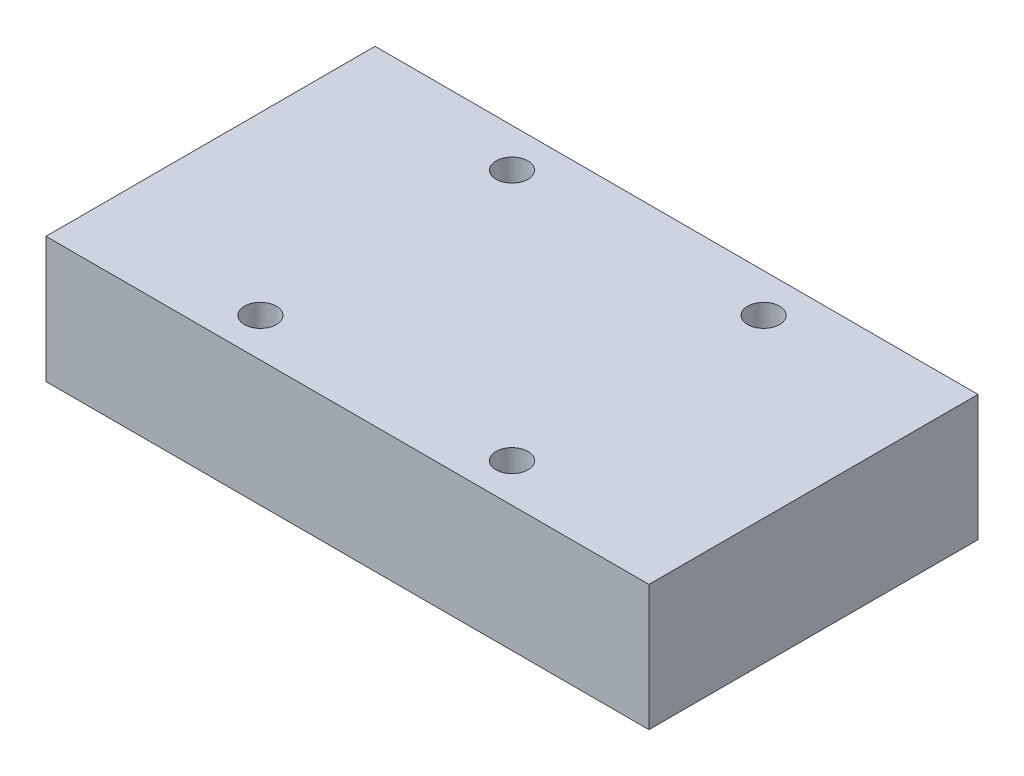
ISO-10303-21;
HEADER;
FILE_DESCRIPTION(('STEP AP214'),'2;1');
FILE_NAME('part.step','',(''),(''),'','','');
FILE_SCHEMA(('AUTOMOTIVE_DESIGN { 1 0 10303 214 1 1 1 1 }'));
ENDSEC;
DATA;
#1=APPLICATION_CONTEXT('core data for automotive mechanical design processes');
#2=APPLICATION_PROTOCOL_DEFINITION('international standard','automotive_design',2000,#1);
#3=PRODUCT_CONTEXT('',#1,'mechanical');
#4=PRODUCT('Part','Part','',(#3));
#5=PRODUCT_RELATED_PRODUCT_CATEGORY('part','',(#4));
#6=PRODUCT_DEFINITION_FORMATION('','',#4);
#7=PRODUCT_DEFINITION_CONTEXT('part definition',#1,'design');
#8=PRODUCT_DEFINITION('design','',#6,#7);
#9=PRODUCT_DEFINITION_SHAPE('','',#8);
#10=(LENGTH_UNIT() NAMED_UNIT(*) SI_UNIT(.MILLI.,.METRE.));
#11=(NAMED_UNIT(*) PLANE_ANGLE_UNIT() SI_UNIT($,.RADIAN.));
#12=(NAMED_UNIT(*) SI_UNIT($,.STERADIAN.) SOLID_ANGLE_UNIT());
#13=UNCERTAINTY_MEASURE_WITH_UNIT(LENGTH_MEASURE(1.E-05),#10,'distance_accuracy_value','');
#14=(GEOMETRIC_REPRESENTATION_CONTEXT(3) GLOBAL_UNCERTAINTY_ASSIGNED_CONTEXT((#13)) GLOBAL_UNIT_ASSIGNED_CONTEXT((#10,
#11,#12)) REPRESENTATION_CONTEXT('',''));
#15=CARTESIAN_POINT('',(0.,0.,0.));
#16=DIRECTION('',(0.,0.,1.));
#17=DIRECTION('',(1.,0.,0.));
#18=AXIS2_PLACEMENT_3D('',#15,#16,#17);
#19=CARTESIAN_POINT('',(31.15,13.,-17.));
#20=DIRECTION('',(-1.,0.,0.));
#21=DIRECTION('',(0.,0.,1.));
#22=AXIS2_PLACEMENT_3D('',#19,#20,#21);
#23=PLANE('',#22);
#24=DIRECTION('',(0.,0.,-1.));
#25=VECTOR('',#24,1.);
#26=CARTESIAN_POINT('',(31.15,0.,-17.));
#27=LINE('',#26,#25);
#28=CARTESIAN_POINT('',(31.15,0.,17.));
#29=VERTEX_POINT('',#28);
#30=CARTESIAN_POINT('',(31.15,0.,-17.));
#31=VERTEX_POINT('',#30);
#32=EDGE_CURVE('E130',#29,#31,#27,.T.);
#33=ORIENTED_EDGE('',*,*,#32,.T.);
#34=DIRECTION('',(0.,-1.,0.));
#35=VECTOR('',#34,1.);
#36=CARTESIAN_POINT('',(31.15,13.,-17.));
#37=LINE('',#36,#35);
#38=CARTESIAN_POINT('',(31.15,13.,-17.));
#39=VERTEX_POINT('',#38);
#40=EDGE_CURVE('E11',#39,#31,#37,.T.);
#41=ORIENTED_EDGE('',*,*,#40,.F.);
#42=DIRECTION('',(0.,0.,-1.));
#43=VECTOR('',#42,1.);
#44=CARTESIAN_POINT('',(31.15,13.,-17.));
#45=LINE('',#44,#43);
#46=CARTESIAN_POINT('',(31.15,13.,17.));
#47=VERTEX_POINT('',#46);
#48=EDGE_CURVE('E131',#47,#39,#45,.T.);
#49=ORIENTED_EDGE('',*,*,#48,.F.);
#50=DIRECTION('',(0.,-1.,0.));
#51=VECTOR('',#50,1.);
#52=CARTESIAN_POINT('',(31.15,13.,17.));
#53=LINE('',#52,#51);
#54=EDGE_CURVE('E137',#47,#29,#53,.T.);
#55=ORIENTED_EDGE('',*,*,#54,.T.);
#56=EDGE_LOOP('',(#33,#41,#49,#55));
#57=FACE_BOUND('',#56,.T.);
#58=ADVANCED_FACE('F37',(#57),#23,.F.);
#59=CARTESIAN_POINT('',(-31.15,13.,-17.));
#60=DIRECTION('',(0.,0.,1.));
#61=DIRECTION('',(1.,0.,0.));
#62=AXIS2_PLACEMENT_3D('',#59,#60,#61);
#63=PLANE('',#62);
#64=DIRECTION('',(-1.,0.,0.));
#65=VECTOR('',#64,1.);
#66=CARTESIAN_POINT('',(-31.15,0.,-17.));
#67=LINE('',#66,#65);
#68=CARTESIAN_POINT('',(-31.15,0.,-17.));
#69=VERTEX_POINT('',#68);
#70=EDGE_CURVE('E140',#31,#69,#67,.T.);
#71=ORIENTED_EDGE('',*,*,#70,.T.);
#72=DIRECTION('',(0.,-1.,0.));
#73=VECTOR('',#72,1.);
#74=CARTESIAN_POINT('',(-31.15,13.,-17.));
#75=LINE('',#74,#73);
#76=CARTESIAN_POINT('',(-31.15,13.,-17.));
#77=VERTEX_POINT('',#76);
#78=EDGE_CURVE('E45',#77,#69,#75,.T.);
#79=ORIENTED_EDGE('',*,*,#78,.F.);
#80=DIRECTION('',(-1.,0.,0.));
#81=VECTOR('',#80,1.);
#82=CARTESIAN_POINT('',(-31.15,13.,-17.));
#83=LINE('',#82,#81);
#84=EDGE_CURVE('E84',#39,#77,#83,.T.);
#85=ORIENTED_EDGE('',*,*,#84,.F.);
#86=ORIENTED_EDGE('',*,*,#40,.T.);
#87=EDGE_LOOP('',(#71,#79,#85,#86));
#88=FACE_BOUND('',#87,.T.);
#89=ADVANCED_FACE('F164',(#88),#63,.F.);
#90=CARTESIAN_POINT('',(-31.15,13.,-17.));
#91=DIRECTION('',(1.,0.,0.));
#92=DIRECTION('',(0.,0.,-1.));
#93=AXIS2_PLACEMENT_3D('',#90,#91,#92);
#94=PLANE('',#93);
#95=DIRECTION('',(0.,0.,1.));
#96=VECTOR('',#95,1.);
#97=CARTESIAN_POINT('',(-31.15,0.,-17.));
#98=LINE('',#97,#96);
#99=CARTESIAN_POINT('',(-31.15,0.,17.));
#100=VERTEX_POINT('',#99);
#101=EDGE_CURVE('E71',#69,#100,#98,.T.);
#102=ORIENTED_EDGE('',*,*,#101,.T.);
#103=DIRECTION('',(0.,-1.,0.));
#104=VECTOR('',#103,1.);
#105=CARTESIAN_POINT('',(-31.15,13.,17.));
#106=LINE('',#105,#104);
#107=CARTESIAN_POINT('',(-31.15,13.,17.));
#108=VERTEX_POINT('',#107);
#109=EDGE_CURVE('E145',#108,#100,#106,.T.);
#110=ORIENTED_EDGE('',*,*,#109,.F.);
#111=DIRECTION('',(0.,0.,1.));
#112=VECTOR('',#111,1.);
#113=CARTESIAN_POINT('',(-31.15,13.,-17.));
#114=LINE('',#113,#112);
#115=EDGE_CURVE('E134',#77,#108,#114,.T.);
#116=ORIENTED_EDGE('',*,*,#115,.F.);
#117=ORIENTED_EDGE('',*,*,#78,.T.);
#118=EDGE_LOOP('',(#102,#110,#116,#117));
#119=FACE_BOUND('',#118,.T.);
#120=ADVANCED_FACE('F147',(#119),#94,.F.);
#121=CARTESIAN_POINT('',(-31.15,13.,17.));
#122=DIRECTION('',(0.,0.,-1.));
#123=DIRECTION('',(-1.,0.,0.));
#124=AXIS2_PLACEMENT_3D('',#121,#122,#123);
#125=PLANE('',#124);
#126=DIRECTION('',(1.,0.,0.));
#127=VECTOR('',#126,1.);
#128=CARTESIAN_POINT('',(-31.15,0.,17.));
#129=LINE('',#128,#127);
#130=EDGE_CURVE('E77',#100,#29,#129,.T.);
#131=ORIENTED_EDGE('',*,*,#130,.T.);
#132=ORIENTED_EDGE('',*,*,#54,.F.);
#133=DIRECTION('',(1.,0.,0.));
#134=VECTOR('',#133,1.);
#135=CARTESIAN_POINT('',(-31.15,13.,17.));
#136=LINE('',#135,#134);
#137=EDGE_CURVE('E53',#108,#47,#136,.T.);
#138=ORIENTED_EDGE('',*,*,#137,.F.);
#139=ORIENTED_EDGE('',*,*,#109,.T.);
#140=EDGE_LOOP('',(#131,#132,#138,#139));
#141=FACE_BOUND('',#140,.T.);
#142=ADVANCED_FACE('F154',(#141),#125,.F.);
#143=CARTESIAN_POINT('',(0.,13.,0.));
#144=DIRECTION('',(0.,1.,0.));
#145=DIRECTION('',(0.,0.,1.));
#146=AXIS2_PLACEMENT_3D('',#143,#144,#145);
#147=PLANE('',#146);
#148=CARTESIAN_POINT('',(-13.,13.,-13.));
#149=DIRECTION('',(0.,1.,0.));
#150=DIRECTION('',(0.,0.,1.));
#151=AXIS2_PLACEMENT_3D('',#148,#149,#150);
#152=CIRCLE('',#151,1.65);
#153=CARTESIAN_POINT('',(-13.,13.,-11.35));
#154=VERTEX_POINT('',#153);
#155=EDGE_CURVE('E108',#154,#154,#152,.T.);
#156=ORIENTED_EDGE('',*,*,#155,.F.);
#157=EDGE_LOOP('',(#156));
#158=FACE_BOUND('',#157,.T.);
#159=CARTESIAN_POINT('',(-13.,13.,13.));
#160=DIRECTION('',(0.,1.,0.));
#161=DIRECTION('',(0.,0.,1.));
#162=AXIS2_PLACEMENT_3D('',#159,#160,#161);
#163=CIRCLE('',#162,1.65);
#164=CARTESIAN_POINT('',(-13.,13.,14.65));
#165=VERTEX_POINT('',#164);
#166=EDGE_CURVE('E107',#165,#165,#163,.T.);
#167=ORIENTED_EDGE('',*,*,#166,.F.);
#168=EDGE_LOOP('',(#167));
#169=FACE_BOUND('',#168,.T.);
#170=CARTESIAN_POINT('',(13.,13.,-13.));
#171=DIRECTION('',(0.,1.,0.));
#172=DIRECTION('',(0.,0.,1.));
#173=AXIS2_PLACEMENT_3D('',#170,#171,#172);
#174=CIRCLE('',#173,1.65);
#175=CARTESIAN_POINT('',(13.,13.,-11.35));
#176=VERTEX_POINT('',#175);
#177=EDGE_CURVE('E118',#176,#176,#174,.T.);
#178=ORIENTED_EDGE('',*,*,#177,.F.);
#179=EDGE_LOOP('',(#178));
#180=FACE_BOUND('',#179,.T.);
#181=CARTESIAN_POINT('',(13.,13.,13.));
#182=DIRECTION('',(0.,1.,0.));
#183=DIRECTION('',(0.,0.,1.));
#184=AXIS2_PLACEMENT_3D('',#181,#182,#183);
#185=CIRCLE('',#184,1.65);
#186=CARTESIAN_POINT('',(13.,13.,14.65));
#187=VERTEX_POINT('',#186);
#188=EDGE_CURVE('E124',#187,#187,#185,.T.);
#189=ORIENTED_EDGE('',*,*,#188,.F.);
#190=EDGE_LOOP('',(#189));
#191=FACE_BOUND('',#190,.T.);
#192=ORIENTED_EDGE('',*,*,#48,.T.);
#193=ORIENTED_EDGE('',*,*,#84,.T.);
#194=ORIENTED_EDGE('',*,*,#115,.T.);
#195=ORIENTED_EDGE('',*,*,#137,.T.);
#196=EDGE_LOOP('',(#192,#193,#194,#195));
#197=FACE_BOUND('',#196,.T.);
#198=ADVANCED_FACE('F156',(#158,#169,#180,#191,#197),#147,.T.);
#199=CARTESIAN_POINT('',(0.,0.,0.));
#200=DIRECTION('',(0.,1.,0.));
#201=DIRECTION('',(0.,0.,1.));
#202=AXIS2_PLACEMENT_3D('',#199,#200,#201);
#203=PLANE('',#202);
#204=ORIENTED_EDGE('',*,*,#32,.F.);
#205=ORIENTED_EDGE('',*,*,#130,.F.);
#206=ORIENTED_EDGE('',*,*,#101,.F.);
#207=ORIENTED_EDGE('',*,*,#70,.F.);
#208=EDGE_LOOP('',(#204,#205,#206,#207));
#209=FACE_BOUND('',#208,.T.);
#210=ADVANCED_FACE('F150',(#209),#203,.F.);
#211=CARTESIAN_POINT('',(13.,8.,13.));
#212=DIRECTION('',(0.,1.,0.));
#213=DIRECTION('',(0.,0.,1.));
#214=AXIS2_PLACEMENT_3D('',#211,#212,#213);
#215=CONICAL_SURFACE('',#214,1.65,1.02974425867665);
#216=CARTESIAN_POINT('',(13.,7.00857997860452,13.));
#217=VERTEX_POINT('',#216);
#218=VERTEX_LOOP('',#217);
#219=FACE_BOUND('',#218,.T.);
#220=CARTESIAN_POINT('',(13.,8.,13.));
#221=DIRECTION('',(0.,1.,0.));
#222=DIRECTION('',(0.,0.,1.));
#223=AXIS2_PLACEMENT_3D('',#220,#221,#222);
#224=CIRCLE('',#223,1.65);
#225=CARTESIAN_POINT('',(13.,8.,14.65));
#226=VERTEX_POINT('',#225);
#227=EDGE_CURVE('E127',#226,#226,#224,.T.);
#228=ORIENTED_EDGE('',*,*,#227,.T.);
#229=EDGE_LOOP('',(#228));
#230=FACE_BOUND('',#229,.T.);
#231=ADVANCED_FACE('F191',(#219,#230),#215,.F.);
#232=CARTESIAN_POINT('',(13.,13.,13.));
#233=DIRECTION('',(0.,1.,0.));
#234=DIRECTION('',(0.,0.,1.));
#235=AXIS2_PLACEMENT_3D('',#232,#233,#234);
#236=CYLINDRICAL_SURFACE('',#235,1.65);
#237=ORIENTED_EDGE('',*,*,#227,.F.);
#238=EDGE_LOOP('',(#237));
#239=FACE_BOUND('',#238,.T.);
#240=ORIENTED_EDGE('',*,*,#188,.T.);
#241=EDGE_LOOP('',(#240));
#242=FACE_BOUND('',#241,.T.);
#243=ADVANCED_FACE('F204',(#239,#242),#236,.F.);
#244=CARTESIAN_POINT('',(13.,8.,-13.));
#245=DIRECTION('',(0.,1.,0.));
#246=DIRECTION('',(0.,0.,1.));
#247=AXIS2_PLACEMENT_3D('',#244,#245,#246);
#248=CONICAL_SURFACE('',#247,1.65,1.02974425867665);
#249=CARTESIAN_POINT('',(13.,7.00857997860452,-13.));
#250=VERTEX_POINT('',#249);
#251=VERTEX_LOOP('',#250);
#252=FACE_BOUND('',#251,.T.);
#253=CARTESIAN_POINT('',(13.,8.,-13.));
#254=DIRECTION('',(0.,1.,0.));
#255=DIRECTION('',(0.,0.,1.));
#256=AXIS2_PLACEMENT_3D('',#253,#254,#255);
#257=CIRCLE('',#256,1.65);
#258=CARTESIAN_POINT('',(13.,8.,-11.35));
#259=VERTEX_POINT('',#258);
#260=EDGE_CURVE('E121',#259,#259,#257,.T.);
#261=ORIENTED_EDGE('',*,*,#260,.T.);
#262=EDGE_LOOP('',(#261));
#263=FACE_BOUND('',#262,.T.);
#264=ADVANCED_FACE('F215',(#252,#263),#248,.F.);
#265=CARTESIAN_POINT('',(13.,13.,-13.));
#266=DIRECTION('',(0.,1.,0.));
#267=DIRECTION('',(0.,0.,1.));
#268=AXIS2_PLACEMENT_3D('',#265,#266,#267);
#269=CYLINDRICAL_SURFACE('',#268,1.65);
#270=ORIENTED_EDGE('',*,*,#260,.F.);
#271=EDGE_LOOP('',(#270));
#272=FACE_BOUND('',#271,.T.);
#273=ORIENTED_EDGE('',*,*,#177,.T.);
#274=EDGE_LOOP('',(#273));
#275=FACE_BOUND('',#274,.T.);
#276=ADVANCED_FACE('F226',(#272,#275),#269,.F.);
#277=CARTESIAN_POINT('',(-13.,8.,13.));
#278=DIRECTION('',(0.,1.,0.));
#279=DIRECTION('',(0.,0.,1.));
#280=AXIS2_PLACEMENT_3D('',#277,#278,#279);
#281=CONICAL_SURFACE('',#280,1.65,1.02974425867665);
#282=CARTESIAN_POINT('',(-13.,7.00857997860452,13.));
#283=VERTEX_POINT('',#282);
#284=VERTEX_LOOP('',#283);
#285=FACE_BOUND('',#284,.T.);
#286=CARTESIAN_POINT('',(-13.,8.,13.));
#287=DIRECTION('',(0.,1.,0.));
#288=DIRECTION('',(0.,0.,1.));
#289=AXIS2_PLACEMENT_3D('',#286,#287,#288);
#290=CIRCLE('',#289,1.65);
#291=CARTESIAN_POINT('',(-13.,8.,14.65));
#292=VERTEX_POINT('',#291);
#293=EDGE_CURVE('E111',#292,#292,#290,.T.);
#294=ORIENTED_EDGE('',*,*,#293,.T.);
#295=EDGE_LOOP('',(#294));
#296=FACE_BOUND('',#295,.T.);
#297=ADVANCED_FACE('F236',(#285,#296),#281,.F.);
#298=CARTESIAN_POINT('',(-13.,13.,13.));
#299=DIRECTION('',(0.,1.,0.));
#300=DIRECTION('',(0.,0.,1.));
#301=AXIS2_PLACEMENT_3D('',#298,#299,#300);
#302=CYLINDRICAL_SURFACE('',#301,1.65);
#303=ORIENTED_EDGE('',*,*,#293,.F.);
#304=EDGE_LOOP('',(#303));
#305=FACE_BOUND('',#304,.T.);
#306=ORIENTED_EDGE('',*,*,#166,.T.);
#307=EDGE_LOOP('',(#306));
#308=FACE_BOUND('',#307,.T.);
#309=ADVANCED_FACE('F101',(#305,#308),#302,.F.);
#310=CARTESIAN_POINT('',(-13.,8.,-13.));
#311=DIRECTION('',(0.,1.,0.));
#312=DIRECTION('',(0.,0.,1.));
#313=AXIS2_PLACEMENT_3D('',#310,#311,#312);
#314=CONICAL_SURFACE('',#313,1.65,1.02974425867665);
#315=CARTESIAN_POINT('',(-13.,7.00857997860452,-13.));
#316=VERTEX_POINT('',#315);
#317=VERTEX_LOOP('',#316);
#318=FACE_BOUND('',#317,.T.);
#319=CARTESIAN_POINT('',(-13.,8.,-13.));
#320=DIRECTION('',(0.,1.,0.));
#321=DIRECTION('',(0.,0.,1.));
#322=AXIS2_PLACEMENT_3D('',#319,#320,#321);
#323=CIRCLE('',#322,1.65);
#324=CARTESIAN_POINT('',(-13.,8.,-11.35));
#325=VERTEX_POINT('',#324);
#326=EDGE_CURVE('E105',#325,#325,#323,.T.);
#327=ORIENTED_EDGE('',*,*,#326,.T.);
#328=EDGE_LOOP('',(#327));
#329=FACE_BOUND('',#328,.T.);
#330=ADVANCED_FACE('F97',(#318,#329),#314,.F.);
#331=CARTESIAN_POINT('',(-13.,13.,-13.));
#332=DIRECTION('',(0.,1.,0.));
#333=DIRECTION('',(0.,0.,1.));
#334=AXIS2_PLACEMENT_3D('',#331,#332,#333);
#335=CYLINDRICAL_SURFACE('',#334,1.65);
#336=ORIENTED_EDGE('',*,*,#326,.F.);
#337=EDGE_LOOP('',(#336));
#338=FACE_BOUND('',#337,.T.);
#339=ORIENTED_EDGE('',*,*,#155,.T.);
#340=EDGE_LOOP('',(#339));
#341=FACE_BOUND('',#340,.T.);
#342=ADVANCED_FACE('F100',(#338,#341),#335,.F.);
#343=CLOSED_SHELL('',(#58,#89,#120,#142,#198,#210,#231,#243,#264,#276,#297,#309,#330,#342));
#344=MANIFOLD_SOLID_BREP('B2',#343);
#345=ADVANCED_BREP_SHAPE_REPRESENTATION('',(#18,#344),#14);
#346=SHAPE_DEFINITION_REPRESENTATION(#9,#345);
ENDSEC;
END-ISO-10303-21;
